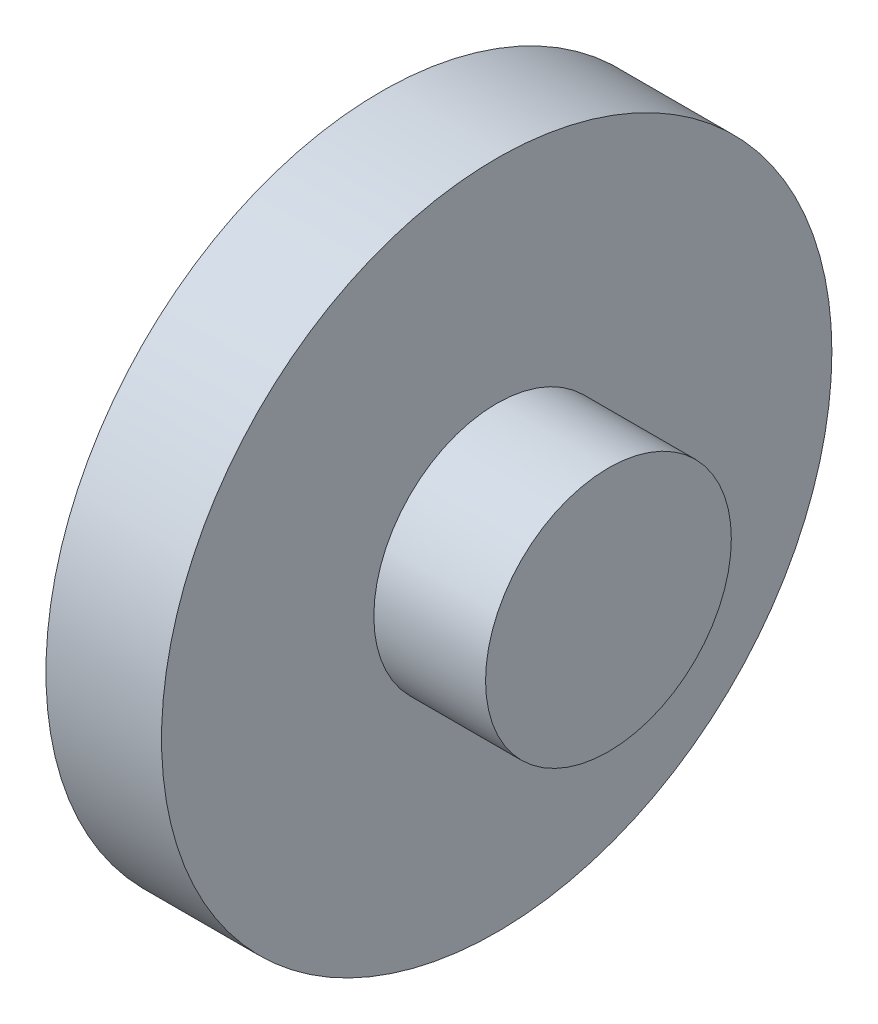
ISO-10303-21;
HEADER;
FILE_DESCRIPTION(('STEP AP214'),'2;1');
FILE_NAME('part.step','',(''),(''),'','','');
FILE_SCHEMA(('AUTOMOTIVE_DESIGN { 1 0 10303 214 1 1 1 1 }'));
ENDSEC;
DATA;
#1=APPLICATION_CONTEXT('core data for automotive mechanical design processes');
#2=APPLICATION_PROTOCOL_DEFINITION('international standard','automotive_design',2000,#1);
#3=PRODUCT_CONTEXT('',#1,'mechanical');
#4=PRODUCT('Part','Part','',(#3));
#5=PRODUCT_RELATED_PRODUCT_CATEGORY('part','',(#4));
#6=PRODUCT_DEFINITION_FORMATION('','',#4);
#7=PRODUCT_DEFINITION_CONTEXT('part definition',#1,'design');
#8=PRODUCT_DEFINITION('design','',#6,#7);
#9=PRODUCT_DEFINITION_SHAPE('','',#8);
#10=(LENGTH_UNIT() NAMED_UNIT(*) SI_UNIT(.MILLI.,.METRE.));
#11=(NAMED_UNIT(*) PLANE_ANGLE_UNIT() SI_UNIT($,.RADIAN.));
#12=(NAMED_UNIT(*) SI_UNIT($,.STERADIAN.) SOLID_ANGLE_UNIT());
#13=UNCERTAINTY_MEASURE_WITH_UNIT(LENGTH_MEASURE(1.E-05),#10,'distance_accuracy_value','');
#14=(GEOMETRIC_REPRESENTATION_CONTEXT(3) GLOBAL_UNCERTAINTY_ASSIGNED_CONTEXT((#13)) GLOBAL_UNIT_ASSIGNED_CONTEXT((#10,
#11,#12)) REPRESENTATION_CONTEXT('',''));
#15=CARTESIAN_POINT('',(0.,0.,0.));
#16=DIRECTION('',(0.,0.,1.));
#17=DIRECTION('',(1.,0.,0.));
#18=AXIS2_PLACEMENT_3D('',#15,#16,#17);
#19=CARTESIAN_POINT('',(0.,0.,0.));
#20=DIRECTION('',(1.,0.,0.));
#21=DIRECTION('',(0.,0.,-1.));
#22=AXIS2_PLACEMENT_3D('',#19,#20,#21);
#23=PLANE('',#22);
#24=CARTESIAN_POINT('',(0.,0.,0.));
#25=DIRECTION('',(1.,0.,0.));
#26=DIRECTION('',(0.,0.,-1.));
#27=AXIS2_PLACEMENT_3D('',#24,#25,#26);
#28=CIRCLE('',#27,15.);
#29=CARTESIAN_POINT('',(0.,0.,-15.));
#30=VERTEX_POINT('',#29);
#31=EDGE_CURVE('E43',#30,#30,#28,.T.);
#32=ORIENTED_EDGE('',*,*,#31,.F.);
#33=EDGE_LOOP('',(#32));
#34=FACE_BOUND('',#33,.T.);
#35=DIRECTION('',(0.,-1.,0.));
#36=VECTOR('',#35,1.);
#37=CARTESIAN_POINT('',(0.,8.35,1.5875));
#38=LINE('',#37,#36);
#39=CARTESIAN_POINT('',(0.,8.35,1.5875));
#40=VERTEX_POINT('',#39);
#41=CARTESIAN_POINT('',(0.,-8.35,1.5875));
#42=VERTEX_POINT('',#41);
#43=EDGE_CURVE('E64',#40,#42,#38,.T.);
#44=ORIENTED_EDGE('',*,*,#43,.T.);
#45=DIRECTION('',(0.,0.,-1.));
#46=VECTOR('',#45,1.);
#47=CARTESIAN_POINT('',(0.,-8.35,1.5875));
#48=LINE('',#47,#46);
#49=CARTESIAN_POINT('',(0.,-8.35,-1.5875));
#50=VERTEX_POINT('',#49);
#51=EDGE_CURVE('E120',#42,#50,#48,.T.);
#52=ORIENTED_EDGE('',*,*,#51,.T.);
#53=DIRECTION('',(0.,1.,0.));
#54=VECTOR('',#53,1.);
#55=CARTESIAN_POINT('',(0.,8.35,-1.5875));
#56=LINE('',#55,#54);
#57=CARTESIAN_POINT('',(0.,8.35,-1.5875));
#58=VERTEX_POINT('',#57);
#59=EDGE_CURVE('E102',#50,#58,#56,.T.);
#60=ORIENTED_EDGE('',*,*,#59,.T.);
#61=DIRECTION('',(0.,0.,1.));
#62=VECTOR('',#61,1.);
#63=CARTESIAN_POINT('',(0.,8.35,1.5875));
#64=LINE('',#63,#62);
#65=EDGE_CURVE('E114',#58,#40,#64,.T.);
#66=ORIENTED_EDGE('',*,*,#65,.T.);
#67=EDGE_LOOP('',(#44,#52,#60,#66));
#68=FACE_BOUND('',#67,.T.);
#69=ADVANCED_FACE('F39',(#34,#68),#23,.F.);
#70=CARTESIAN_POINT('',(4.175,0.,0.));
#71=DIRECTION('',(-1.,0.,0.));
#72=DIRECTION('',(0.,0.,1.));
#73=AXIS2_PLACEMENT_3D('',#70,#71,#72);
#74=CYLINDRICAL_SURFACE('',#73,15.);
#75=ORIENTED_EDGE('',*,*,#31,.T.);
#76=EDGE_LOOP('',(#75));
#77=FACE_BOUND('',#76,.T.);
#78=CARTESIAN_POINT('',(5.175,0.,0.));
#79=DIRECTION('',(1.,0.,0.));
#80=DIRECTION('',(0.,0.,-1.));
#81=AXIS2_PLACEMENT_3D('',#78,#79,#80);
#82=CIRCLE('',#81,15.);
#83=CARTESIAN_POINT('',(5.175,0.,-15.));
#84=VERTEX_POINT('',#83);
#85=EDGE_CURVE('E125',#84,#84,#82,.T.);
#86=ORIENTED_EDGE('',*,*,#85,.F.);
#87=EDGE_LOOP('',(#86));
#88=FACE_BOUND('',#87,.T.);
#89=ADVANCED_FACE('F41',(#77,#88),#74,.T.);
#90=CARTESIAN_POINT('',(4.175,8.35,1.5875));
#91=DIRECTION('',(0.,0.,-1.));
#92=DIRECTION('',(-1.,0.,0.));
#93=AXIS2_PLACEMENT_3D('',#90,#91,#92);
#94=PLANE('',#93);
#95=ORIENTED_EDGE('',*,*,#43,.F.);
#96=DIRECTION('',(-1.,0.,0.));
#97=VECTOR('',#96,1.);
#98=CARTESIAN_POINT('',(4.175,8.35,1.5875));
#99=LINE('',#98,#97);
#100=CARTESIAN_POINT('',(4.175,8.35,1.5875));
#101=VERTEX_POINT('',#100);
#102=EDGE_CURVE('E109',#101,#40,#99,.T.);
#103=ORIENTED_EDGE('',*,*,#102,.F.);
#104=DIRECTION('',(0.,-1.,0.));
#105=VECTOR('',#104,1.);
#106=CARTESIAN_POINT('',(4.175,8.35,1.5875));
#107=LINE('',#106,#105);
#108=CARTESIAN_POINT('',(4.175,-8.35,1.5875));
#109=VERTEX_POINT('',#108);
#110=EDGE_CURVE('E98',#101,#109,#107,.T.);
#111=ORIENTED_EDGE('',*,*,#110,.T.);
#112=DIRECTION('',(-1.,0.,0.));
#113=VECTOR('',#112,1.);
#114=CARTESIAN_POINT('',(4.175,-8.35,1.5875));
#115=LINE('',#114,#113);
#116=EDGE_CURVE('E96',#109,#42,#115,.T.);
#117=ORIENTED_EDGE('',*,*,#116,.T.);
#118=EDGE_LOOP('',(#95,#103,#111,#117));
#119=FACE_BOUND('',#118,.T.);
#120=ADVANCED_FACE('F153',(#119),#94,.T.);
#121=CARTESIAN_POINT('',(4.175,-8.35,1.5875));
#122=DIRECTION('',(0.,1.,0.));
#123=DIRECTION('',(0.,0.,1.));
#124=AXIS2_PLACEMENT_3D('',#121,#122,#123);
#125=PLANE('',#124);
#126=ORIENTED_EDGE('',*,*,#51,.F.);
#127=ORIENTED_EDGE('',*,*,#116,.F.);
#128=DIRECTION('',(0.,0.,-1.));
#129=VECTOR('',#128,1.);
#130=CARTESIAN_POINT('',(4.175,-8.35,1.5875));
#131=LINE('',#130,#129);
#132=CARTESIAN_POINT('',(4.175,-8.35,-1.5875));
#133=VERTEX_POINT('',#132);
#134=EDGE_CURVE('E85',#109,#133,#131,.T.);
#135=ORIENTED_EDGE('',*,*,#134,.T.);
#136=DIRECTION('',(-1.,0.,0.));
#137=VECTOR('',#136,1.);
#138=CARTESIAN_POINT('',(4.175,-8.35,-1.5875));
#139=LINE('',#138,#137);
#140=EDGE_CURVE('E94',#133,#50,#139,.T.);
#141=ORIENTED_EDGE('',*,*,#140,.T.);
#142=EDGE_LOOP('',(#126,#127,#135,#141));
#143=FACE_BOUND('',#142,.T.);
#144=ADVANCED_FACE('F93',(#143),#125,.T.);
#145=CARTESIAN_POINT('',(4.175,8.35,-1.5875));
#146=DIRECTION('',(0.,0.,1.));
#147=DIRECTION('',(1.,0.,0.));
#148=AXIS2_PLACEMENT_3D('',#145,#146,#147);
#149=PLANE('',#148);
#150=ORIENTED_EDGE('',*,*,#59,.F.);
#151=ORIENTED_EDGE('',*,*,#140,.F.);
#152=DIRECTION('',(0.,1.,0.));
#153=VECTOR('',#152,1.);
#154=CARTESIAN_POINT('',(4.175,8.35,-1.5875));
#155=LINE('',#154,#153);
#156=CARTESIAN_POINT('',(4.175,8.35,-1.5875));
#157=VERTEX_POINT('',#156);
#158=EDGE_CURVE('E82',#133,#157,#155,.T.);
#159=ORIENTED_EDGE('',*,*,#158,.T.);
#160=DIRECTION('',(-1.,0.,0.));
#161=VECTOR('',#160,1.);
#162=CARTESIAN_POINT('',(4.175,8.35,-1.5875));
#163=LINE('',#162,#161);
#164=EDGE_CURVE('E105',#157,#58,#163,.T.);
#165=ORIENTED_EDGE('',*,*,#164,.T.);
#166=EDGE_LOOP('',(#150,#151,#159,#165));
#167=FACE_BOUND('',#166,.T.);
#168=ADVANCED_FACE('F100',(#167),#149,.T.);
#169=CARTESIAN_POINT('',(4.175,8.35,1.5875));
#170=DIRECTION('',(0.,-1.,0.));
#171=DIRECTION('',(0.,0.,-1.));
#172=AXIS2_PLACEMENT_3D('',#169,#170,#171);
#173=PLANE('',#172);
#174=ORIENTED_EDGE('',*,*,#65,.F.);
#175=ORIENTED_EDGE('',*,*,#164,.F.);
#176=DIRECTION('',(0.,0.,1.));
#177=VECTOR('',#176,1.);
#178=CARTESIAN_POINT('',(4.175,8.35,1.5875));
#179=LINE('',#178,#177);
#180=EDGE_CURVE('E56',#157,#101,#179,.T.);
#181=ORIENTED_EDGE('',*,*,#180,.T.);
#182=ORIENTED_EDGE('',*,*,#102,.T.);
#183=EDGE_LOOP('',(#174,#175,#181,#182));
#184=FACE_BOUND('',#183,.T.);
#185=ADVANCED_FACE('F167',(#184),#173,.T.);
#186=CARTESIAN_POINT('',(4.175,0.,0.));
#187=DIRECTION('',(1.,0.,0.));
#188=DIRECTION('',(0.,0.,-1.));
#189=AXIS2_PLACEMENT_3D('',#186,#187,#188);
#190=PLANE('',#189);
#191=ORIENTED_EDGE('',*,*,#134,.F.);
#192=ORIENTED_EDGE('',*,*,#110,.F.);
#193=ORIENTED_EDGE('',*,*,#180,.F.);
#194=ORIENTED_EDGE('',*,*,#158,.F.);
#195=EDGE_LOOP('',(#191,#192,#193,#194));
#196=FACE_BOUND('',#195,.T.);
#197=ADVANCED_FACE('F84',(#196),#190,.F.);
#198=CARTESIAN_POINT('',(5.175,0.,0.));
#199=DIRECTION('',(1.,0.,0.));
#200=DIRECTION('',(0.,0.,-1.));
#201=AXIS2_PLACEMENT_3D('',#198,#199,#200);
#202=PLANE('',#201);
#203=CARTESIAN_POINT('',(5.175,0.,0.));
#204=DIRECTION('',(1.,0.,0.));
#205=DIRECTION('',(0.,0.,-1.));
#206=AXIS2_PLACEMENT_3D('',#203,#204,#205);
#207=CIRCLE('',#206,5.5);
#208=CARTESIAN_POINT('',(5.175,0.,-5.5));
#209=VERTEX_POINT('',#208);
#210=EDGE_CURVE('E11',#209,#209,#207,.T.);
#211=ORIENTED_EDGE('',*,*,#210,.F.);
#212=EDGE_LOOP('',(#211));
#213=FACE_BOUND('',#212,.T.);
#214=ORIENTED_EDGE('',*,*,#85,.T.);
#215=EDGE_LOOP('',(#214));
#216=FACE_BOUND('',#215,.T.);
#217=ADVANCED_FACE('F143',(#213,#216),#202,.T.);
#218=CARTESIAN_POINT('',(10.175,0.,0.));
#219=DIRECTION('',(-1.,0.,0.));
#220=DIRECTION('',(0.,0.,1.));
#221=AXIS2_PLACEMENT_3D('',#218,#219,#220);
#222=CYLINDRICAL_SURFACE('',#221,5.5);
#223=CARTESIAN_POINT('',(10.175,0.,0.));
#224=DIRECTION('',(1.,0.,0.));
#225=DIRECTION('',(0.,0.,-1.));
#226=AXIS2_PLACEMENT_3D('',#223,#224,#225);
#227=CIRCLE('',#226,5.5);
#228=CARTESIAN_POINT('',(10.175,0.,-5.5));
#229=VERTEX_POINT('',#228);
#230=EDGE_CURVE('E132',#229,#229,#227,.T.);
#231=ORIENTED_EDGE('',*,*,#230,.F.);
#232=EDGE_LOOP('',(#231));
#233=FACE_BOUND('',#232,.T.);
#234=ORIENTED_EDGE('',*,*,#210,.T.);
#235=EDGE_LOOP('',(#234));
#236=FACE_BOUND('',#235,.T.);
#237=ADVANCED_FACE('F140',(#233,#236),#222,.T.);
#238=CARTESIAN_POINT('',(10.175,0.,0.));
#239=DIRECTION('',(1.,0.,0.));
#240=DIRECTION('',(0.,0.,-1.));
#241=AXIS2_PLACEMENT_3D('',#238,#239,#240);
#242=PLANE('',#241);
#243=ORIENTED_EDGE('',*,*,#230,.T.);
#244=EDGE_LOOP('',(#243));
#245=FACE_BOUND('',#244,.T.);
#246=ADVANCED_FACE('F138',(#245),#242,.T.);
#247=CLOSED_SHELL('',(#69,#89,#120,#144,#168,#185,#197,#217,#237,#246));
#248=MANIFOLD_SOLID_BREP('B2',#247);
#249=ADVANCED_BREP_SHAPE_REPRESENTATION('',(#18,#248),#14);
#250=SHAPE_DEFINITION_REPRESENTATION(#9,#249);
ENDSEC;
END-ISO-10303-21;
